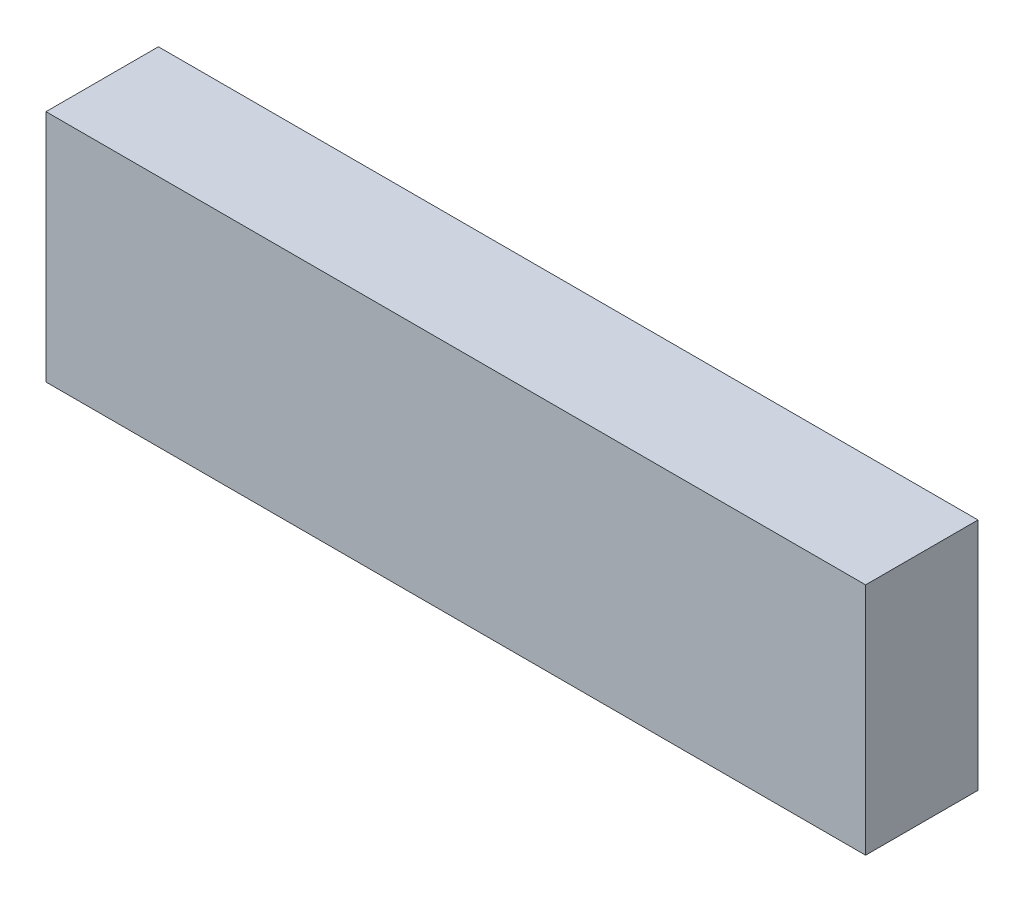
ISO-10303-21;
HEADER;
FILE_DESCRIPTION(('STEP AP214'),'2;1');
FILE_NAME('part.step','',(''),(''),'','','');
FILE_SCHEMA(('AUTOMOTIVE_DESIGN { 1 0 10303 214 1 1 1 1 }'));
ENDSEC;
DATA;
#1=APPLICATION_CONTEXT('core data for automotive mechanical design processes');
#2=APPLICATION_PROTOCOL_DEFINITION('international standard','automotive_design',2000,#1);
#3=PRODUCT_CONTEXT('',#1,'mechanical');
#4=PRODUCT('Part','Part','',(#3));
#5=PRODUCT_RELATED_PRODUCT_CATEGORY('part','',(#4));
#6=PRODUCT_DEFINITION_FORMATION('','',#4);
#7=PRODUCT_DEFINITION_CONTEXT('part definition',#1,'design');
#8=PRODUCT_DEFINITION('design','',#6,#7);
#9=PRODUCT_DEFINITION_SHAPE('','',#8);
#10=(LENGTH_UNIT() NAMED_UNIT(*) SI_UNIT(.MILLI.,.METRE.));
#11=(NAMED_UNIT(*) PLANE_ANGLE_UNIT() SI_UNIT($,.RADIAN.));
#12=(NAMED_UNIT(*) SI_UNIT($,.STERADIAN.) SOLID_ANGLE_UNIT());
#13=UNCERTAINTY_MEASURE_WITH_UNIT(LENGTH_MEASURE(1.E-05),#10,'distance_accuracy_value','');
#14=(GEOMETRIC_REPRESENTATION_CONTEXT(3) GLOBAL_UNCERTAINTY_ASSIGNED_CONTEXT((#13)) GLOBAL_UNIT_ASSIGNED_CONTEXT((#10,
#11,#12)) REPRESENTATION_CONTEXT('',''));
#15=CARTESIAN_POINT('',(0.,0.,0.));
#16=DIRECTION('',(0.,0.,1.));
#17=DIRECTION('',(1.,0.,0.));
#18=AXIS2_PLACEMENT_3D('',#15,#16,#17);
#19=CARTESIAN_POINT('',(0.,0.,0.24));
#20=DIRECTION('',(1.,0.,0.));
#21=DIRECTION('',(0.,0.,-1.));
#22=AXIS2_PLACEMENT_3D('',#19,#20,#21);
#23=PLANE('',#22);
#24=DIRECTION('',(0.,-1.,0.));
#25=VECTOR('',#24,1.);
#26=CARTESIAN_POINT('',(0.,0.,0.));
#27=LINE('',#26,#25);
#28=CARTESIAN_POINT('',(0.,0.5,0.));
#29=VERTEX_POINT('',#28);
#30=CARTESIAN_POINT('',(0.,0.,0.));
#31=VERTEX_POINT('',#30);
#32=EDGE_CURVE('E100',#29,#31,#27,.T.);
#33=ORIENTED_EDGE('',*,*,#32,.T.);
#34=DIRECTION('',(0.,0.,-1.));
#35=VECTOR('',#34,1.);
#36=CARTESIAN_POINT('',(0.,0.,0.24));
#37=LINE('',#36,#35);
#38=CARTESIAN_POINT('',(0.,0.,0.24));
#39=VERTEX_POINT('',#38);
#40=EDGE_CURVE('E11',#39,#31,#37,.T.);
#41=ORIENTED_EDGE('',*,*,#40,.F.);
#42=DIRECTION('',(0.,-1.,0.));
#43=VECTOR('',#42,1.);
#44=CARTESIAN_POINT('',(0.,0.,0.24));
#45=LINE('',#44,#43);
#46=CARTESIAN_POINT('',(0.,0.5,0.24));
#47=VERTEX_POINT('',#46);
#48=EDGE_CURVE('E88',#47,#39,#45,.T.);
#49=ORIENTED_EDGE('',*,*,#48,.F.);
#50=DIRECTION('',(0.,0.,-1.));
#51=VECTOR('',#50,1.);
#52=CARTESIAN_POINT('',(0.,0.5,0.24));
#53=LINE('',#52,#51);
#54=EDGE_CURVE('E96',#47,#29,#53,.T.);
#55=ORIENTED_EDGE('',*,*,#54,.T.);
#56=EDGE_LOOP('',(#33,#41,#49,#55));
#57=FACE_BOUND('',#56,.T.);
#58=ADVANCED_FACE('F37',(#57),#23,.F.);
#59=CARTESIAN_POINT('',(0.,0.,0.24));
#60=DIRECTION('',(0.,1.,0.));
#61=DIRECTION('',(0.,0.,1.));
#62=AXIS2_PLACEMENT_3D('',#59,#60,#61);
#63=PLANE('',#62);
#64=DIRECTION('',(1.,0.,0.));
#65=VECTOR('',#64,1.);
#66=CARTESIAN_POINT('',(0.,0.,0.));
#67=LINE('',#66,#65);
#68=CARTESIAN_POINT('',(1.75,0.,0.));
#69=VERTEX_POINT('',#68);
#70=EDGE_CURVE('E92',#31,#69,#67,.T.);
#71=ORIENTED_EDGE('',*,*,#70,.T.);
#72=DIRECTION('',(0.,0.,-1.));
#73=VECTOR('',#72,1.);
#74=CARTESIAN_POINT('',(1.75,0.,0.24));
#75=LINE('',#74,#73);
#76=CARTESIAN_POINT('',(1.75,0.,0.24));
#77=VERTEX_POINT('',#76);
#78=EDGE_CURVE('E45',#77,#69,#75,.T.);
#79=ORIENTED_EDGE('',*,*,#78,.F.);
#80=DIRECTION('',(1.,0.,0.));
#81=VECTOR('',#80,1.);
#82=CARTESIAN_POINT('',(0.,0.,0.24));
#83=LINE('',#82,#81);
#84=EDGE_CURVE('E83',#39,#77,#83,.T.);
#85=ORIENTED_EDGE('',*,*,#84,.F.);
#86=ORIENTED_EDGE('',*,*,#40,.T.);
#87=EDGE_LOOP('',(#71,#79,#85,#86));
#88=FACE_BOUND('',#87,.T.);
#89=ADVANCED_FACE('F91',(#88),#63,.F.);
#90=CARTESIAN_POINT('',(1.75,0.,0.24));
#91=DIRECTION('',(-1.,0.,0.));
#92=DIRECTION('',(0.,0.,1.));
#93=AXIS2_PLACEMENT_3D('',#90,#91,#92);
#94=PLANE('',#93);
#95=DIRECTION('',(0.,1.,0.));
#96=VECTOR('',#95,1.);
#97=CARTESIAN_POINT('',(1.75,0.,0.));
#98=LINE('',#97,#96);
#99=CARTESIAN_POINT('',(1.75,0.5,0.));
#100=VERTEX_POINT('',#99);
#101=EDGE_CURVE('E70',#69,#100,#98,.T.);
#102=ORIENTED_EDGE('',*,*,#101,.T.);
#103=DIRECTION('',(0.,0.,-1.));
#104=VECTOR('',#103,1.);
#105=CARTESIAN_POINT('',(1.75,0.5,0.24));
#106=LINE('',#105,#104);
#107=CARTESIAN_POINT('',(1.75,0.5,0.24));
#108=VERTEX_POINT('',#107);
#109=EDGE_CURVE('E93',#108,#100,#106,.T.);
#110=ORIENTED_EDGE('',*,*,#109,.F.);
#111=DIRECTION('',(0.,1.,0.));
#112=VECTOR('',#111,1.);
#113=CARTESIAN_POINT('',(1.75,0.,0.24));
#114=LINE('',#113,#112);
#115=EDGE_CURVE('E86',#77,#108,#114,.T.);
#116=ORIENTED_EDGE('',*,*,#115,.F.);
#117=ORIENTED_EDGE('',*,*,#78,.T.);
#118=EDGE_LOOP('',(#102,#110,#116,#117));
#119=FACE_BOUND('',#118,.T.);
#120=ADVANCED_FACE('F94',(#119),#94,.F.);
#121=CARTESIAN_POINT('',(0.,0.5,0.24));
#122=DIRECTION('',(0.,-1.,0.));
#123=DIRECTION('',(0.,0.,-1.));
#124=AXIS2_PLACEMENT_3D('',#121,#122,#123);
#125=PLANE('',#124);
#126=DIRECTION('',(-1.,0.,0.));
#127=VECTOR('',#126,1.);
#128=CARTESIAN_POINT('',(0.,0.5,0.));
#129=LINE('',#128,#127);
#130=EDGE_CURVE('E76',#100,#29,#129,.T.);
#131=ORIENTED_EDGE('',*,*,#130,.T.);
#132=ORIENTED_EDGE('',*,*,#54,.F.);
#133=DIRECTION('',(-1.,0.,0.));
#134=VECTOR('',#133,1.);
#135=CARTESIAN_POINT('',(0.,0.5,0.24));
#136=LINE('',#135,#134);
#137=EDGE_CURVE('E53',#108,#47,#136,.T.);
#138=ORIENTED_EDGE('',*,*,#137,.F.);
#139=ORIENTED_EDGE('',*,*,#109,.T.);
#140=EDGE_LOOP('',(#131,#132,#138,#139));
#141=FACE_BOUND('',#140,.T.);
#142=ADVANCED_FACE('F107',(#141),#125,.F.);
#143=CARTESIAN_POINT('',(0.,0.,0.24));
#144=DIRECTION('',(0.,0.,-1.));
#145=DIRECTION('',(-1.,0.,0.));
#146=AXIS2_PLACEMENT_3D('',#143,#144,#145);
#147=PLANE('',#146);
#148=ORIENTED_EDGE('',*,*,#48,.T.);
#149=ORIENTED_EDGE('',*,*,#84,.T.);
#150=ORIENTED_EDGE('',*,*,#115,.T.);
#151=ORIENTED_EDGE('',*,*,#137,.T.);
#152=EDGE_LOOP('',(#148,#149,#150,#151));
#153=FACE_BOUND('',#152,.T.);
#154=ADVANCED_FACE('F84',(#153),#147,.F.);
#155=CARTESIAN_POINT('',(0.,0.,0.));
#156=DIRECTION('',(0.,0.,-1.));
#157=DIRECTION('',(-1.,0.,0.));
#158=AXIS2_PLACEMENT_3D('',#155,#156,#157);
#159=PLANE('',#158);
#160=ORIENTED_EDGE('',*,*,#32,.F.);
#161=ORIENTED_EDGE('',*,*,#130,.F.);
#162=ORIENTED_EDGE('',*,*,#101,.F.);
#163=ORIENTED_EDGE('',*,*,#70,.F.);
#164=EDGE_LOOP('',(#160,#161,#162,#163));
#165=FACE_BOUND('',#164,.T.);
#166=ADVANCED_FACE('F110',(#165),#159,.T.);
#167=CLOSED_SHELL('',(#58,#89,#120,#142,#154,#166));
#168=MANIFOLD_SOLID_BREP('B2',#167);
#169=ADVANCED_BREP_SHAPE_REPRESENTATION('',(#18,#168),#14);
#170=SHAPE_DEFINITION_REPRESENTATION(#9,#169);
ENDSEC;
END-ISO-10303-21;
